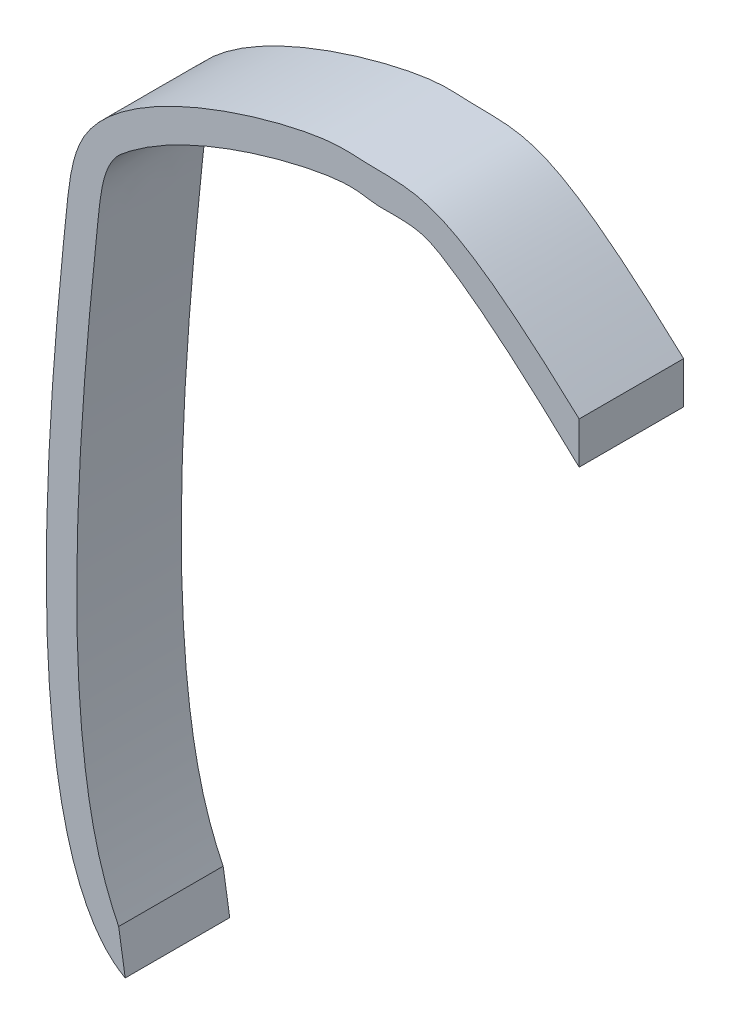
ISO-10303-21;
HEADER;
FILE_DESCRIPTION(('STEP AP214'),'2;1');
FILE_NAME('part.step','',(''),(''),'','','');
FILE_SCHEMA(('AUTOMOTIVE_DESIGN { 1 0 10303 214 1 1 1 1 }'));
ENDSEC;
DATA;
#1=APPLICATION_CONTEXT('core data for automotive mechanical design processes');
#2=APPLICATION_PROTOCOL_DEFINITION('international standard','automotive_design',2000,#1);
#3=PRODUCT_CONTEXT('',#1,'mechanical');
#4=PRODUCT('Part','Part','',(#3));
#5=PRODUCT_RELATED_PRODUCT_CATEGORY('part','',(#4));
#6=PRODUCT_DEFINITION_FORMATION('','',#4);
#7=PRODUCT_DEFINITION_CONTEXT('part definition',#1,'design');
#8=PRODUCT_DEFINITION('design','',#6,#7);
#9=PRODUCT_DEFINITION_SHAPE('','',#8);
#10=(LENGTH_UNIT() NAMED_UNIT(*) SI_UNIT(.MILLI.,.METRE.));
#11=(NAMED_UNIT(*) PLANE_ANGLE_UNIT() SI_UNIT($,.RADIAN.));
#12=(NAMED_UNIT(*) SI_UNIT($,.STERADIAN.) SOLID_ANGLE_UNIT());
#13=UNCERTAINTY_MEASURE_WITH_UNIT(LENGTH_MEASURE(1.E-05),#10,'distance_accuracy_value','');
#14=(GEOMETRIC_REPRESENTATION_CONTEXT(3) GLOBAL_UNCERTAINTY_ASSIGNED_CONTEXT((#13)) GLOBAL_UNIT_ASSIGNED_CONTEXT((#10,
#11,#12)) REPRESENTATION_CONTEXT('',''));
#15=CARTESIAN_POINT('',(0.,0.,0.));
#16=DIRECTION('',(0.,0.,1.));
#17=DIRECTION('',(1.,0.,0.));
#18=AXIS2_PLACEMENT_3D('',#15,#16,#17);
#19=CARTESIAN_POINT('',(0.,0.,0.));
#20=DIRECTION('',(-1.,0.,0.));
#21=DIRECTION('',(0.,0.,1.));
#22=AXIS2_PLACEMENT_3D('',#19,#20,#21);
#23=PLANE('',#22);
#24=DIRECTION('',(0.,-1.,0.));
#25=VECTOR('',#24,1.);
#26=CARTESIAN_POINT('',(0.,465.,0.));
#27=LINE('',#26,#25);
#28=CARTESIAN_POINT('',(0.,465.,0.));
#29=VERTEX_POINT('',#28);
#30=CARTESIAN_POINT('',(0.,445.,0.));
#31=VERTEX_POINT('',#30);
#32=EDGE_CURVE('E71',#29,#31,#27,.T.);
#33=ORIENTED_EDGE('',*,*,#32,.F.);
#34=DIRECTION('',(0.,0.,-1.));
#35=VECTOR('',#34,1.);
#36=CARTESIAN_POINT('',(0.,465.,0.));
#37=LINE('',#36,#35);
#38=CARTESIAN_POINT('',(0.,465.,50.));
#39=VERTEX_POINT('',#38);
#40=EDGE_CURVE('E73',#39,#29,#37,.T.);
#41=ORIENTED_EDGE('',*,*,#40,.F.);
#42=DIRECTION('',(0.,1.,0.));
#43=VECTOR('',#42,1.);
#44=CARTESIAN_POINT('',(0.,465.,50.));
#45=LINE('',#44,#43);
#46=CARTESIAN_POINT('',(0.,445.,50.));
#47=VERTEX_POINT('',#46);
#48=EDGE_CURVE('E88',#47,#39,#45,.T.);
#49=ORIENTED_EDGE('',*,*,#48,.F.);
#50=DIRECTION('',(0.,0.,1.));
#51=VECTOR('',#50,1.);
#52=CARTESIAN_POINT('',(0.,445.,0.));
#53=LINE('',#52,#51);
#54=EDGE_CURVE('E69',#31,#47,#53,.T.);
#55=ORIENTED_EDGE('',*,*,#54,.F.);
#56=EDGE_LOOP('',(#33,#41,#49,#55));
#57=FACE_BOUND('',#56,.T.);
#58=ADVANCED_FACE('F33',(#57),#23,.F.);
#59=CARTESIAN_POINT('',(-290.16002484198,584.039086371492,0.));
#60=DIRECTION('',(0.987598548904482,0.157000338221808,0.));
#61=DIRECTION('',(0.,0.,1.));
#62=AXIS2_PLACEMENT_3D('',#59,#60,#61);
#63=PLANE('',#62);
#64=DIRECTION('',(-0.157000338221808,0.987598548904482,0.));
#65=VECTOR('',#64,1.);
#66=CARTESIAN_POINT('',(-217.154867568839,124.805761130908,0.));
#67=LINE('',#66,#65);
#68=CARTESIAN_POINT('',(-217.154867568839,124.805761130908,0.));
#69=VERTEX_POINT('',#68);
#70=CARTESIAN_POINT('',(-220.294874333275,144.557732108998,0.));
#71=VERTEX_POINT('',#70);
#72=EDGE_CURVE('E93',#69,#71,#67,.T.);
#73=ORIENTED_EDGE('',*,*,#72,.T.);
#74=DIRECTION('',(0.,0.,1.));
#75=VECTOR('',#74,1.);
#76=CARTESIAN_POINT('',(-220.294874333275,144.557732108998,0.));
#77=LINE('',#76,#75);
#78=CARTESIAN_POINT('',(-220.294874333275,144.557732108998,50.));
#79=VERTEX_POINT('',#78);
#80=EDGE_CURVE('E167',#71,#79,#77,.T.);
#81=ORIENTED_EDGE('',*,*,#80,.T.);
#82=DIRECTION('',(0.157000338221808,-0.987598548904482,0.));
#83=VECTOR('',#82,1.);
#84=CARTESIAN_POINT('',(-217.154867568839,124.805761130908,50.));
#85=LINE('',#84,#83);
#86=CARTESIAN_POINT('',(-217.154867568839,124.805761130908,50.));
#87=VERTEX_POINT('',#86);
#88=EDGE_CURVE('E43',#79,#87,#85,.T.);
#89=ORIENTED_EDGE('',*,*,#88,.T.);
#90=DIRECTION('',(0.,0.,-1.));
#91=VECTOR('',#90,1.);
#92=CARTESIAN_POINT('',(-217.154867568839,124.805761130908,0.));
#93=LINE('',#92,#91);
#94=EDGE_CURVE('E11',#87,#69,#93,.T.);
#95=ORIENTED_EDGE('',*,*,#94,.T.);
#96=EDGE_LOOP('',(#73,#81,#89,#95));
#97=FACE_BOUND('',#96,.T.);
#98=ADVANCED_FACE('F113',(#97),#63,.T.);
#99=CARTESIAN_POINT('',(0.,465.,0.));
#100=DIRECTION('',(0.,0.,-1.));
#101=DIRECTION('',(-1.,0.,0.));
#102=AXIS2_PLACEMENT_3D('',#99,#100,#101);
#103=PLANE('',#102);
#104=CARTESIAN_POINT('',(0.,445.,0.));
#105=CARTESIAN_POINT('',(-16.5334790418302,460.69711347542,0.));
#106=CARTESIAN_POINT('',(-29.3494082354157,472.022889874603,0.));
#107=CARTESIAN_POINT('',(-44.3443437745634,484.331517105527,0.));
#108=CARTESIAN_POINT('',(-48.6324401807244,487.656274375071,0.));
#109=CARTESIAN_POINT('',(-56.0116089863636,493.123364084595,0.));
#110=CARTESIAN_POINT('',(-59.0953120526458,495.268253561463,0.));
#111=CARTESIAN_POINT('',(-64.4338384201303,498.794945149483,0.));
#112=CARTESIAN_POINT('',(-66.6891825700647,500.187034199315,0.));
#113=CARTESIAN_POINT('',(-71.068650718633,502.479301416099,0.));
#114=CARTESIAN_POINT('',(-73.212489970105,503.371980377179,0.));
#115=CARTESIAN_POINT('',(-78.0720677294839,504.630735217202,0.));
#116=CARTESIAN_POINT('',(-80.7872506423757,504.981714498095,0.));
#117=CARTESIAN_POINT('',(-87.0830582029829,505.275974958553,0.));
#118=CARTESIAN_POINT('',(-90.6563561100172,505.225226604885,0.));
#119=CARTESIAN_POINT('',(-97.4933270969146,505.178079929066,0.));
#120=CARTESIAN_POINT('',(-99.6523927721094,505.610978059376,0.));
#121=CARTESIAN_POINT('',(-104.85822401797,506.385191824863,0.));
#122=CARTESIAN_POINT('',(-107.974322721402,506.704258935392,0.));
#123=CARTESIAN_POINT('',(-115.485984851211,506.330616096859,0.));
#124=CARTESIAN_POINT('',(-119.284664335196,505.857088712353,0.));
#125=CARTESIAN_POINT('',(-127.739186614086,504.414231343719,0.));
#126=CARTESIAN_POINT('',(-132.402175874663,503.441341587578,0.));
#127=CARTESIAN_POINT('',(-147.136896460812,499.87292444242,0.));
#128=CARTESIAN_POINT('',(-157.954318983385,496.618871224689,0.));
#129=CARTESIAN_POINT('',(-178.884778297007,488.859974126448,0.));
#130=CARTESIAN_POINT('',(-188.987826213656,484.327309026921,0.));
#131=CARTESIAN_POINT('',(-201.741879108666,477.333437867636,0.));
#132=CARTESIAN_POINT('',(-205.592680852994,474.97778104944,0.));
#133=CARTESIAN_POINT('',(-212.314720560171,470.474235317099,0.));
#134=CARTESIAN_POINT('',(-215.177815709986,468.338522888187,0.));
#135=CARTESIAN_POINT('',(-219.378061590568,465.033849437963,0.));
#136=CARTESIAN_POINT('',(-220.943914518211,463.504561662782,0.));
#137=CARTESIAN_POINT('',(-223.705830572011,459.826160751409,0.));
#138=CARTESIAN_POINT('',(-224.893078939403,457.676595627404,0.));
#139=CARTESIAN_POINT('',(-226.862213936424,452.662277075239,0.));
#140=CARTESIAN_POINT('',(-227.642645645806,449.803221339329,0.));
#141=CARTESIAN_POINT('',(-228.889626205964,443.421353561903,0.));
#142=CARTESIAN_POINT('',(-229.357993867641,439.900825824972,0.));
#143=CARTESIAN_POINT('',(-232.168019123921,413.523508935029,0.));
#144=CARTESIAN_POINT('',(-234.974765903991,385.624540105678,0.));
#145=CARTESIAN_POINT('',(-239.183376487318,326.346527039198,0.));
#146=CARTESIAN_POINT('',(-240.575796680382,294.966331297681,0.));
#147=CARTESIAN_POINT('',(-240.154364956276,250.933872073782,0.));
#148=CARTESIAN_POINT('',(-239.596861021536,236.76516449067,0.));
#149=CARTESIAN_POINT('',(-237.509026520442,210.443523621524,0.));
#150=CARTESIAN_POINT('',(-235.968908449297,198.291871831841,0.));
#151=CARTESIAN_POINT('',(-233.004282773568,182.362591836326,0.));
#152=CARTESIAN_POINT('',(-231.909740224757,177.436743611926,0.));
#153=CARTESIAN_POINT('',(-229.58423629937,168.470000803379,0.));
#154=CARTESIAN_POINT('',(-228.353126708193,164.43176143749,0.));
#155=CARTESIAN_POINT('',(-225.895164868564,157.299545651994,0.));
#156=CARTESIAN_POINT('',(-224.673686044689,154.210508124478,0.));
#157=CARTESIAN_POINT('',(-222.38913326827,148.859569333134,0.));
#158=CARTESIAN_POINT('',(-221.340813457417,146.587455316381,0.));
#159=CARTESIAN_POINT('',(-220.294874333275,144.557732108998,0.));
#160=B_SPLINE_CURVE_WITH_KNOTS('',3,(#104,#105,#106,#107,#108,#109,#110,#111,#112,#113,#114,
#115,#116,#117,#118,#119,#120,#121,#122,#123,#124,#125,#126,#127,#128,#129,#130,#131,#132,#133,
#134,#135,#136,#137,#138,#139,#140,#141,#142,#143,#144,#145,#146,#147,#148,#149,#150,#151,#152,
#153,#154,#155,#156,#157,#158,#159),.UNSPECIFIED.,.F.,.F.,(4,2,2,2,2,2,2,2,2,2,2,2,2,2,2,2,2,2,
2,2,2,2,2,2,2,2,2,4),(0.,0.0869113832541203,0.13036707488118,0.173822766508241,
0.217278458135301,0.260734149762361,0.304189841389421,0.347645533016481,0.377540678676314,
0.407435824336146,0.428598834209535,0.449761844082924,0.492087863829703,0.534413883576481,
0.55557689344987,0.576739903323259,0.59208308296169,0.607426262600121,0.622769442238553,
0.638112621876984,0.728584466407738,0.819056310938492,0.864292233203869,0.909528155469246,
0.932146116601934,0.954764077734623,0.977382038867311,1.),.UNSPECIFIED.);
#161=EDGE_CURVE('E94',#31,#71,#160,.T.);
#162=ORIENTED_EDGE('',*,*,#161,.T.);
#163=ORIENTED_EDGE('',*,*,#72,.F.);
#164=CARTESIAN_POINT('',(0.,465.,0.));
#165=CARTESIAN_POINT('',(-16.9692495650053,480.696658697854,0.));
#166=CARTESIAN_POINT('',(-30.3952213348168,492.022655652211,0.));
#167=CARTESIAN_POINT('',(-52.4598074794755,508.217408808877,0.));
#168=CARTESIAN_POINT('',(-61.0987165659525,513.067089628339,0.));
#169=CARTESIAN_POINT('',(-75.7808060771797,518.702442276289,0.));
#170=CARTESIAN_POINT('',(-81.7862929650254,519.514777139451,0.));
#171=CARTESIAN_POINT('',(-93.9497907885615,520.144262840915,0.));
#172=CARTESIAN_POINT('',(-100.180764776125,519.959582986057,0.));
#173=CARTESIAN_POINT('',(-110.306837925926,520.536457233113,0.));
#174=CARTESIAN_POINT('',(-112.919950918061,520.599097646775,0.));
#175=CARTESIAN_POINT('',(-119.307732278662,520.237395221261,0.));
#176=CARTESIAN_POINT('',(-123.090066924832,519.826351572934,0.));
#177=CARTESIAN_POINT('',(-134.953779564474,517.746832800321,0.));
#178=CARTESIAN_POINT('',(-144.205346352819,515.638996136659,0.));
#179=CARTESIAN_POINT('',(-164.629307112682,509.598062562773,0.));
#180=CARTESIAN_POINT('',(-175.81293643024,505.675967471472,0.));
#181=CARTESIAN_POINT('',(-197.543612874847,496.126961242112,0.));
#182=CARTESIAN_POINT('',(-208.095949387086,490.496755164458,0.));
#183=CARTESIAN_POINT('',(-225.891605249607,477.692333758214,0.));
#184=CARTESIAN_POINT('',(-233.118942216872,470.488634598589,0.));
#185=CARTESIAN_POINT('',(-240.305558435385,457.255821877806,0.));
#186=CARTESIAN_POINT('',(-241.966957352378,451.442566506672,0.));
#187=CARTESIAN_POINT('',(-244.301676199682,438.676778126149,0.));
#188=CARTESIAN_POINT('',(-244.943498164111,431.716074982712,0.));
#189=CARTESIAN_POINT('',(-248.057759119408,401.377211394057,0.));
#190=CARTESIAN_POINT('',(-250.706753141214,373.268942599883,0.));
#191=CARTESIAN_POINT('',(-254.414932820795,313.379032918074,0.));
#192=CARTESIAN_POINT('',(-255.473936081157,281.595394740299,0.));
#193=CARTESIAN_POINT('',(-253.711884620831,221.658393242476,0.));
#194=CARTESIAN_POINT('',(-250.888894476327,193.480811618531,0.));
#195=CARTESIAN_POINT('',(-241.979829102966,159.670850248482,0.));
#196=CARTESIAN_POINT('',(-238.223799599952,149.814742735164,0.));
#197=CARTESIAN_POINT('',(-231.267292125818,138.000154937626,0.));
#198=CARTESIAN_POINT('',(-228.729391025024,134.559509425504,0.));
#199=CARTESIAN_POINT('',(-223.237815421055,128.812369246162,0.));
#200=CARTESIAN_POINT('',(-220.285023234843,126.508640145891,0.));
#201=CARTESIAN_POINT('',(-217.154867568839,124.805761130908,0.));
#202=B_SPLINE_CURVE_WITH_KNOTS('',3,(#164,#165,#166,#167,#168,#169,#170,#171,#172,#173,#174,
#175,#176,#177,#178,#179,#180,#181,#182,#183,#184,#185,#186,#187,#188,#189,#190,#191,#192,#193,
#194,#195,#196,#197,#198,#199,#200,#201),.UNSPECIFIED.,.F.,.F.,(4,2,2,2,2,2,2,2,2,2,2,2,2,2,2,2,
2,2,4),(0.,0.0869113832541203,0.173822766508241,0.260734149762361,0.347645533016481,
0.377540678676314,0.407435824336146,0.449761844082924,0.492087863829703,0.534413883576481,
0.576739903323259,0.607426262600121,0.638112621876984,0.728584466407738,0.819056310938492,
0.909528155469246,0.954764077734623,0.977382038867311,1.),.UNSPECIFIED.);
#203=EDGE_CURVE('E36',#29,#69,#202,.T.);
#204=ORIENTED_EDGE('',*,*,#203,.F.);
#205=ORIENTED_EDGE('',*,*,#32,.T.);
#206=EDGE_LOOP('',(#162,#163,#204,#205));
#207=FACE_BOUND('',#206,.T.);
#208=ADVANCED_FACE('F92',(#207),#103,.T.);
#209=CARTESIAN_POINT('',(0.,445.,0.));
#210=CARTESIAN_POINT('',(-16.5334790418302,460.69711347542,0.));
#211=CARTESIAN_POINT('',(-29.3494082354157,472.022889874603,0.));
#212=CARTESIAN_POINT('',(-44.3443437745634,484.331517105527,0.));
#213=CARTESIAN_POINT('',(-48.6324401807244,487.656274375071,0.));
#214=CARTESIAN_POINT('',(-56.0116089863636,493.123364084595,0.));
#215=CARTESIAN_POINT('',(-59.0953120526458,495.268253561463,0.));
#216=CARTESIAN_POINT('',(-64.4338384201303,498.794945149483,0.));
#217=CARTESIAN_POINT('',(-66.6891825700647,500.187034199315,0.));
#218=CARTESIAN_POINT('',(-71.068650718633,502.479301416099,0.));
#219=CARTESIAN_POINT('',(-73.212489970105,503.371980377179,0.));
#220=CARTESIAN_POINT('',(-78.0720677294839,504.630735217202,0.));
#221=CARTESIAN_POINT('',(-80.7872506423757,504.981714498095,0.));
#222=CARTESIAN_POINT('',(-87.0830582029829,505.275974958553,0.));
#223=CARTESIAN_POINT('',(-90.6563561100172,505.225226604885,0.));
#224=CARTESIAN_POINT('',(-97.4933270969146,505.178079929066,0.));
#225=CARTESIAN_POINT('',(-99.6523927721094,505.610978059376,0.));
#226=CARTESIAN_POINT('',(-104.85822401797,506.385191824863,0.));
#227=CARTESIAN_POINT('',(-107.974322721402,506.704258935392,0.));
#228=CARTESIAN_POINT('',(-115.485984851211,506.330616096859,0.));
#229=CARTESIAN_POINT('',(-119.284664335196,505.857088712353,0.));
#230=CARTESIAN_POINT('',(-127.739186614086,504.414231343719,0.));
#231=CARTESIAN_POINT('',(-132.402175874663,503.441341587578,0.));
#232=CARTESIAN_POINT('',(-147.136896460812,499.87292444242,0.));
#233=CARTESIAN_POINT('',(-157.954318983385,496.618871224689,0.));
#234=CARTESIAN_POINT('',(-178.884778297007,488.859974126448,0.));
#235=CARTESIAN_POINT('',(-188.987826213656,484.327309026921,0.));
#236=CARTESIAN_POINT('',(-201.741879108666,477.333437867636,0.));
#237=CARTESIAN_POINT('',(-205.592680852994,474.97778104944,0.));
#238=CARTESIAN_POINT('',(-212.314720560171,470.474235317099,0.));
#239=CARTESIAN_POINT('',(-215.177815709986,468.338522888187,0.));
#240=CARTESIAN_POINT('',(-219.378061590568,465.033849437963,0.));
#241=CARTESIAN_POINT('',(-220.943914518211,463.504561662782,0.));
#242=CARTESIAN_POINT('',(-223.705830572011,459.826160751409,0.));
#243=CARTESIAN_POINT('',(-224.893078939403,457.676595627404,0.));
#244=CARTESIAN_POINT('',(-226.862213936424,452.662277075239,0.));
#245=CARTESIAN_POINT('',(-227.642645645806,449.803221339329,0.));
#246=CARTESIAN_POINT('',(-228.889626205964,443.421353561903,0.));
#247=CARTESIAN_POINT('',(-229.357993867641,439.900825824972,0.));
#248=CARTESIAN_POINT('',(-232.168019123921,413.523508935029,0.));
#249=CARTESIAN_POINT('',(-234.974765903991,385.624540105678,0.));
#250=CARTESIAN_POINT('',(-239.183376487318,326.346527039198,0.));
#251=CARTESIAN_POINT('',(-240.575796680382,294.966331297681,0.));
#252=CARTESIAN_POINT('',(-240.154364956276,250.933872073782,0.));
#253=CARTESIAN_POINT('',(-239.596861021536,236.76516449067,0.));
#254=CARTESIAN_POINT('',(-237.509026520442,210.443523621524,0.));
#255=CARTESIAN_POINT('',(-235.968908449297,198.291871831841,0.));
#256=CARTESIAN_POINT('',(-233.004282773568,182.362591836326,0.));
#257=CARTESIAN_POINT('',(-231.909740224757,177.436743611926,0.));
#258=CARTESIAN_POINT('',(-229.58423629937,168.470000803379,0.));
#259=CARTESIAN_POINT('',(-228.353126708193,164.43176143749,0.));
#260=CARTESIAN_POINT('',(-225.895164868564,157.299545651994,0.));
#261=CARTESIAN_POINT('',(-224.673686044689,154.210508124478,0.));
#262=CARTESIAN_POINT('',(-222.38913326827,148.859569333134,0.));
#263=CARTESIAN_POINT('',(-221.340813457417,146.587455316381,0.));
#264=CARTESIAN_POINT('',(-220.294874333275,144.557732108998,0.));
#265=CARTESIAN_POINT('',(0.,445.,50.));
#266=CARTESIAN_POINT('',(-16.5334790418302,460.69711347542,50.));
#267=CARTESIAN_POINT('',(-29.3494082354157,472.022889874603,50.));
#268=CARTESIAN_POINT('',(-44.3443437745634,484.331517105527,50.));
#269=CARTESIAN_POINT('',(-48.6324401807244,487.656274375071,50.));
#270=CARTESIAN_POINT('',(-56.0116089863636,493.123364084595,50.));
#271=CARTESIAN_POINT('',(-59.0953120526458,495.268253561463,50.));
#272=CARTESIAN_POINT('',(-64.4338384201303,498.794945149483,50.));
#273=CARTESIAN_POINT('',(-66.6891825700647,500.187034199315,50.));
#274=CARTESIAN_POINT('',(-71.068650718633,502.479301416099,50.));
#275=CARTESIAN_POINT('',(-73.212489970105,503.371980377179,50.));
#276=CARTESIAN_POINT('',(-78.0720677294839,504.630735217202,50.));
#277=CARTESIAN_POINT('',(-80.7872506423757,504.981714498095,50.));
#278=CARTESIAN_POINT('',(-87.0830582029829,505.275974958553,50.));
#279=CARTESIAN_POINT('',(-90.6563561100172,505.225226604885,50.));
#280=CARTESIAN_POINT('',(-97.4933270969146,505.178079929066,50.));
#281=CARTESIAN_POINT('',(-99.6523927721094,505.610978059376,50.));
#282=CARTESIAN_POINT('',(-104.85822401797,506.385191824863,50.));
#283=CARTESIAN_POINT('',(-107.974322721402,506.704258935392,50.));
#284=CARTESIAN_POINT('',(-115.485984851211,506.330616096859,50.));
#285=CARTESIAN_POINT('',(-119.284664335196,505.857088712353,50.));
#286=CARTESIAN_POINT('',(-127.739186614086,504.414231343719,50.));
#287=CARTESIAN_POINT('',(-132.402175874663,503.441341587578,50.));
#288=CARTESIAN_POINT('',(-147.136896460812,499.87292444242,50.));
#289=CARTESIAN_POINT('',(-157.954318983385,496.618871224689,50.));
#290=CARTESIAN_POINT('',(-178.884778297007,488.859974126448,50.));
#291=CARTESIAN_POINT('',(-188.987826213656,484.327309026921,50.));
#292=CARTESIAN_POINT('',(-201.741879108666,477.333437867636,50.));
#293=CARTESIAN_POINT('',(-205.592680852994,474.97778104944,50.));
#294=CARTESIAN_POINT('',(-212.314720560171,470.474235317099,50.));
#295=CARTESIAN_POINT('',(-215.177815709986,468.338522888187,50.));
#296=CARTESIAN_POINT('',(-219.378061590568,465.033849437963,50.));
#297=CARTESIAN_POINT('',(-220.943914518211,463.504561662782,50.));
#298=CARTESIAN_POINT('',(-223.705830572011,459.826160751409,50.));
#299=CARTESIAN_POINT('',(-224.893078939403,457.676595627404,50.));
#300=CARTESIAN_POINT('',(-226.862213936424,452.662277075239,50.));
#301=CARTESIAN_POINT('',(-227.642645645806,449.803221339329,50.));
#302=CARTESIAN_POINT('',(-228.889626205964,443.421353561903,50.));
#303=CARTESIAN_POINT('',(-229.357993867641,439.900825824972,50.));
#304=CARTESIAN_POINT('',(-232.168019123921,413.523508935029,50.));
#305=CARTESIAN_POINT('',(-234.974765903991,385.624540105678,50.));
#306=CARTESIAN_POINT('',(-239.183376487318,326.346527039198,50.));
#307=CARTESIAN_POINT('',(-240.575796680382,294.966331297681,50.));
#308=CARTESIAN_POINT('',(-240.154364956276,250.933872073782,50.));
#309=CARTESIAN_POINT('',(-239.596861021536,236.76516449067,50.));
#310=CARTESIAN_POINT('',(-237.509026520442,210.443523621524,50.));
#311=CARTESIAN_POINT('',(-235.968908449297,198.291871831841,50.));
#312=CARTESIAN_POINT('',(-233.004282773568,182.362591836326,50.));
#313=CARTESIAN_POINT('',(-231.909740224757,177.436743611926,50.));
#314=CARTESIAN_POINT('',(-229.58423629937,168.470000803379,50.));
#315=CARTESIAN_POINT('',(-228.353126708193,164.43176143749,50.));
#316=CARTESIAN_POINT('',(-225.895164868564,157.299545651994,50.));
#317=CARTESIAN_POINT('',(-224.673686044689,154.210508124478,50.));
#318=CARTESIAN_POINT('',(-222.38913326827,148.859569333134,50.));
#319=CARTESIAN_POINT('',(-221.340813457417,146.587455316381,50.));
#320=CARTESIAN_POINT('',(-220.294874333275,144.557732108998,50.));
#321=B_SPLINE_SURFACE_WITH_KNOTS('',1,3,((#209,#210,#211,#212,#213,#214,#215,#216,#217,#218,
#219,#220,#221,#222,#223,#224,#225,#226,#227,#228,#229,#230,#231,#232,#233,#234,#235,#236,#237,
#238,#239,#240,#241,#242,#243,#244,#245,#246,#247,#248,#249,#250,#251,#252,#253,#254,#255,#256,
#257,#258,#259,#260,#261,#262,#263,#264),(#265,#266,#267,#268,#269,#270,#271,#272,#273,#274,
#275,#276,#277,#278,#279,#280,#281,#282,#283,#284,#285,#286,#287,#288,#289,#290,#291,#292,#293,
#294,#295,#296,#297,#298,#299,#300,#301,#302,#303,#304,#305,#306,#307,#308,#309,#310,#311,#312,
#313,#314,#315,#316,#317,#318,#319,#320)),.UNSPECIFIED.,.F.,.F.,.F.,(2,2),(4,2,2,2,2,2,2,2,2,2,
2,2,2,2,2,2,2,2,2,2,2,2,2,2,2,2,2,4),(0.,1.),(0.,0.0869113832541203,0.13036707488118,
0.173822766508241,0.217278458135301,0.260734149762361,0.304189841389421,0.347645533016481,
0.377540678676314,0.407435824336146,0.428598834209535,0.449761844082924,0.492087863829703,
0.534413883576481,0.55557689344987,0.576739903323259,0.59208308296169,0.607426262600121,
0.622769442238553,0.638112621876984,0.728584466407738,0.819056310938492,0.864292233203869,
0.909528155469246,0.932146116601934,0.954764077734623,0.977382038867311,1.),.UNSPECIFIED.);
#322=CARTESIAN_POINT('',(0.,445.,50.));
#323=CARTESIAN_POINT('',(-16.5334790418302,460.69711347542,50.));
#324=CARTESIAN_POINT('',(-29.3494082354157,472.022889874603,50.));
#325=CARTESIAN_POINT('',(-44.3443437745634,484.331517105527,50.));
#326=CARTESIAN_POINT('',(-48.6324401807244,487.656274375071,50.));
#327=CARTESIAN_POINT('',(-56.0116089863636,493.123364084595,50.));
#328=CARTESIAN_POINT('',(-59.0953120526458,495.268253561463,50.));
#329=CARTESIAN_POINT('',(-64.4338384201303,498.794945149483,50.));
#330=CARTESIAN_POINT('',(-66.6891825700647,500.187034199315,50.));
#331=CARTESIAN_POINT('',(-71.068650718633,502.479301416099,50.));
#332=CARTESIAN_POINT('',(-73.212489970105,503.371980377179,50.));
#333=CARTESIAN_POINT('',(-78.0720677294839,504.630735217202,50.));
#334=CARTESIAN_POINT('',(-80.7872506423757,504.981714498095,50.));
#335=CARTESIAN_POINT('',(-87.0830582029829,505.275974958553,50.));
#336=CARTESIAN_POINT('',(-90.6563561100172,505.225226604885,50.));
#337=CARTESIAN_POINT('',(-97.4933270969146,505.178079929066,50.));
#338=CARTESIAN_POINT('',(-99.6523927721094,505.610978059376,50.));
#339=CARTESIAN_POINT('',(-104.85822401797,506.385191824863,50.));
#340=CARTESIAN_POINT('',(-107.974322721402,506.704258935392,50.));
#341=CARTESIAN_POINT('',(-115.485984851211,506.330616096859,50.));
#342=CARTESIAN_POINT('',(-119.284664335196,505.857088712353,50.));
#343=CARTESIAN_POINT('',(-127.739186614086,504.414231343719,50.));
#344=CARTESIAN_POINT('',(-132.402175874663,503.441341587578,50.));
#345=CARTESIAN_POINT('',(-147.136896460812,499.87292444242,50.));
#346=CARTESIAN_POINT('',(-157.954318983385,496.618871224689,50.));
#347=CARTESIAN_POINT('',(-178.884778297007,488.859974126448,50.));
#348=CARTESIAN_POINT('',(-188.987826213656,484.327309026921,50.));
#349=CARTESIAN_POINT('',(-201.741879108666,477.333437867636,50.));
#350=CARTESIAN_POINT('',(-205.592680852994,474.97778104944,50.));
#351=CARTESIAN_POINT('',(-212.314720560171,470.474235317099,50.));
#352=CARTESIAN_POINT('',(-215.177815709986,468.338522888187,50.));
#353=CARTESIAN_POINT('',(-219.378061590568,465.033849437963,50.));
#354=CARTESIAN_POINT('',(-220.943914518211,463.504561662782,50.));
#355=CARTESIAN_POINT('',(-223.705830572011,459.826160751409,50.));
#356=CARTESIAN_POINT('',(-224.893078939403,457.676595627404,50.));
#357=CARTESIAN_POINT('',(-226.862213936424,452.662277075239,50.));
#358=CARTESIAN_POINT('',(-227.642645645806,449.803221339329,50.));
#359=CARTESIAN_POINT('',(-228.889626205964,443.421353561903,50.));
#360=CARTESIAN_POINT('',(-229.357993867641,439.900825824972,50.));
#361=CARTESIAN_POINT('',(-232.168019123921,413.523508935029,50.));
#362=CARTESIAN_POINT('',(-234.974765903991,385.624540105678,50.));
#363=CARTESIAN_POINT('',(-239.183376487318,326.346527039198,50.));
#364=CARTESIAN_POINT('',(-240.575796680382,294.966331297681,50.));
#365=CARTESIAN_POINT('',(-240.154364956276,250.933872073782,50.));
#366=CARTESIAN_POINT('',(-239.596861021536,236.76516449067,50.));
#367=CARTESIAN_POINT('',(-237.509026520442,210.443523621524,50.));
#368=CARTESIAN_POINT('',(-235.968908449297,198.291871831841,50.));
#369=CARTESIAN_POINT('',(-233.004282773568,182.362591836326,50.));
#370=CARTESIAN_POINT('',(-231.909740224757,177.436743611926,50.));
#371=CARTESIAN_POINT('',(-229.58423629937,168.470000803379,50.));
#372=CARTESIAN_POINT('',(-228.353126708193,164.43176143749,50.));
#373=CARTESIAN_POINT('',(-225.895164868564,157.299545651994,50.));
#374=CARTESIAN_POINT('',(-224.673686044689,154.210508124478,50.));
#375=CARTESIAN_POINT('',(-222.38913326827,148.859569333134,50.));
#376=CARTESIAN_POINT('',(-221.340813457417,146.587455316381,50.));
#377=CARTESIAN_POINT('',(-220.294874333275,144.557732108998,50.));
#378=B_SPLINE_CURVE_WITH_KNOTS('',3,(#322,#323,#324,#325,#326,#327,#328,#329,#330,#331,#332,
#333,#334,#335,#336,#337,#338,#339,#340,#341,#342,#343,#344,#345,#346,#347,#348,#349,#350,#351,
#352,#353,#354,#355,#356,#357,#358,#359,#360,#361,#362,#363,#364,#365,#366,#367,#368,#369,#370,
#371,#372,#373,#374,#375,#376,#377),.UNSPECIFIED.,.F.,.F.,(4,2,2,2,2,2,2,2,2,2,2,2,2,2,2,2,2,2,
2,2,2,2,2,2,2,2,2,4),(0.,0.0869113832541203,0.13036707488118,0.173822766508241,
0.217278458135301,0.260734149762361,0.304189841389421,0.347645533016481,0.377540678676314,
0.407435824336146,0.428598834209535,0.449761844082924,0.492087863829703,0.534413883576481,
0.55557689344987,0.576739903323259,0.59208308296169,0.607426262600121,0.622769442238553,
0.638112621876984,0.728584466407738,0.819056310938492,0.864292233203869,0.909528155469246,
0.932146116601934,0.954764077734623,0.977382038867311,1.),.UNSPECIFIED.);
#379=EDGE_CURVE('E151',#47,#79,#378,.T.);
#380=ORIENTED_EDGE('',*,*,#379,.T.);
#381=ORIENTED_EDGE('',*,*,#80,.F.);
#382=ORIENTED_EDGE('',*,*,#161,.F.);
#383=ORIENTED_EDGE('',*,*,#54,.T.);
#384=EDGE_LOOP('',(#380,#381,#382,#383));
#385=FACE_BOUND('',#384,.T.);
#386=ADVANCED_FACE('F112',(#385),#321,.T.);
#387=CARTESIAN_POINT('',(0.,465.,50.));
#388=DIRECTION('',(0.,0.,-1.));
#389=DIRECTION('',(-1.,0.,0.));
#390=AXIS2_PLACEMENT_3D('',#387,#388,#389);
#391=PLANE('',#390);
#392=CARTESIAN_POINT('',(0.,465.,50.));
#393=CARTESIAN_POINT('',(-16.9692495650053,480.696658697854,50.));
#394=CARTESIAN_POINT('',(-30.3952213348168,492.022655652211,50.));
#395=CARTESIAN_POINT('',(-52.4598074794755,508.217408808877,50.));
#396=CARTESIAN_POINT('',(-61.0987165659525,513.067089628339,50.));
#397=CARTESIAN_POINT('',(-75.7808060771797,518.702442276289,50.));
#398=CARTESIAN_POINT('',(-81.7862929650254,519.514777139451,50.));
#399=CARTESIAN_POINT('',(-93.9497907885615,520.144262840915,50.));
#400=CARTESIAN_POINT('',(-100.180764776125,519.959582986057,50.));
#401=CARTESIAN_POINT('',(-110.306837925926,520.536457233113,50.));
#402=CARTESIAN_POINT('',(-112.919950918061,520.599097646775,50.));
#403=CARTESIAN_POINT('',(-119.307732278662,520.237395221261,50.));
#404=CARTESIAN_POINT('',(-123.090066924832,519.826351572934,50.));
#405=CARTESIAN_POINT('',(-134.953779564474,517.746832800321,50.));
#406=CARTESIAN_POINT('',(-144.205346352819,515.638996136659,50.));
#407=CARTESIAN_POINT('',(-164.629307112682,509.598062562773,50.));
#408=CARTESIAN_POINT('',(-175.81293643024,505.675967471472,50.));
#409=CARTESIAN_POINT('',(-197.543612874847,496.126961242112,50.));
#410=CARTESIAN_POINT('',(-208.095949387086,490.496755164458,50.));
#411=CARTESIAN_POINT('',(-225.891605249607,477.692333758214,50.));
#412=CARTESIAN_POINT('',(-233.118942216872,470.488634598589,50.));
#413=CARTESIAN_POINT('',(-240.305558435385,457.255821877806,50.));
#414=CARTESIAN_POINT('',(-241.966957352378,451.442566506672,50.));
#415=CARTESIAN_POINT('',(-244.301676199682,438.676778126149,50.));
#416=CARTESIAN_POINT('',(-244.943498164111,431.716074982712,50.));
#417=CARTESIAN_POINT('',(-248.057759119408,401.377211394057,50.));
#418=CARTESIAN_POINT('',(-250.706753141214,373.268942599883,50.));
#419=CARTESIAN_POINT('',(-254.414932820795,313.379032918074,50.));
#420=CARTESIAN_POINT('',(-255.473936081157,281.595394740299,50.));
#421=CARTESIAN_POINT('',(-253.711884620831,221.658393242476,50.));
#422=CARTESIAN_POINT('',(-250.888894476327,193.480811618531,50.));
#423=CARTESIAN_POINT('',(-241.979829102966,159.670850248482,50.));
#424=CARTESIAN_POINT('',(-238.223799599952,149.814742735164,50.));
#425=CARTESIAN_POINT('',(-231.267292125818,138.000154937626,50.));
#426=CARTESIAN_POINT('',(-228.729391025024,134.559509425504,50.));
#427=CARTESIAN_POINT('',(-223.237815421055,128.812369246162,50.));
#428=CARTESIAN_POINT('',(-220.285023234843,126.508640145891,50.));
#429=CARTESIAN_POINT('',(-217.154867568839,124.805761130908,50.));
#430=B_SPLINE_CURVE_WITH_KNOTS('',3,(#392,#393,#394,#395,#396,#397,#398,#399,#400,#401,#402,
#403,#404,#405,#406,#407,#408,#409,#410,#411,#412,#413,#414,#415,#416,#417,#418,#419,#420,#421,
#422,#423,#424,#425,#426,#427,#428,#429),.UNSPECIFIED.,.F.,.F.,(4,2,2,2,2,2,2,2,2,2,2,2,2,2,2,2,
2,2,4),(0.,0.0869113832541203,0.173822766508241,0.260734149762361,0.347645533016481,
0.377540678676314,0.407435824336146,0.449761844082924,0.492087863829703,0.534413883576481,
0.576739903323259,0.607426262600121,0.638112621876984,0.728584466407738,0.819056310938492,
0.909528155469246,0.954764077734623,0.977382038867311,1.),.UNSPECIFIED.);
#431=EDGE_CURVE('E86',#39,#87,#430,.T.);
#432=ORIENTED_EDGE('',*,*,#431,.T.);
#433=ORIENTED_EDGE('',*,*,#88,.F.);
#434=ORIENTED_EDGE('',*,*,#379,.F.);
#435=ORIENTED_EDGE('',*,*,#48,.T.);
#436=EDGE_LOOP('',(#432,#433,#434,#435));
#437=FACE_BOUND('',#436,.T.);
#438=ADVANCED_FACE('F118',(#437),#391,.F.);
#439=CARTESIAN_POINT('',(0.,465.,50.));
#440=CARTESIAN_POINT('',(-16.9692495650053,480.696658697854,50.));
#441=CARTESIAN_POINT('',(-30.3952213348168,492.022655652211,50.));
#442=CARTESIAN_POINT('',(-46.9436609433108,504.168720519711,50.));
#443=CARTESIAN_POINT('',(-51.8610928363316,507.409466162276,50.));
#444=CARTESIAN_POINT('',(-60.7743090683439,512.563772303303,50.));
#445=CARTESIAN_POINT('',(-64.7692389437592,514.475927790327,50.));
#446=CARTESIAN_POINT('',(-72.1102836993729,517.293604114301,50.));
#447=CARTESIAN_POINT('',(-75.4543018215437,518.199689467403,50.));
#448=CARTESIAN_POINT('',(-81.811532873946,519.387096905591,50.));
#449=CARTESIAN_POINT('',(-84.8271674209095,519.672148564817,50.));
#450=CARTESIAN_POINT('',(-90.9089163326775,519.986891415549,50.));
#451=CARTESIAN_POINT('',(-93.9781170663094,520.015797172471,50.));
#452=CARTESIAN_POINT('',(-100.498427665117,520.110072877828,50.));
#453=CARTESIAN_POINT('',(-103.947981525756,520.174198295841,50.));
#454=CARTESIAN_POINT('',(-110.306837925926,520.536457233113,50.));
#455=CARTESIAN_POINT('',(-112.919950918061,520.599097646775,50.));
#456=CARTESIAN_POINT('',(-119.307732278662,520.237395221261,50.));
#457=CARTESIAN_POINT('',(-123.090066924832,519.826351572934,50.));
#458=CARTESIAN_POINT('',(-131.47734898745,518.356195389098,50.));
#459=CARTESIAN_POINT('',(-135.531338859264,517.528063346342,50.));
#460=CARTESIAN_POINT('',(-144.447807037154,515.413689765745,50.));
#461=CARTESIAN_POINT('',(-149.311336542784,514.128762743188,50.));
#462=CARTESIAN_POINT('',(-164.629307112682,509.598062562773,50.));
#463=CARTESIAN_POINT('',(-175.81293643024,505.675967471472,50.));
#464=CARTESIAN_POINT('',(-197.543612874847,496.126961242112,50.));
#465=CARTESIAN_POINT('',(-208.095949387086,490.496755164458,50.));
#466=CARTESIAN_POINT('',(-221.442691283976,480.893439109775,50.));
#467=CARTESIAN_POINT('',(-225.476285741849,477.499597787261,50.));
#468=CARTESIAN_POINT('',(-232.357385455332,470.379964898914,50.));
#469=CARTESIAN_POINT('',(-235.202019525439,466.653036443762,50.));
#470=CARTESIAN_POINT('',(-238.795327634696,460.03663008337,50.));
#471=CARTESIAN_POINT('',(-239.959154885504,457.192599040403,50.));
#472=CARTESIAN_POINT('',(-241.836958906455,451.300762008823,50.));
#473=CARTESIAN_POINT('',(-242.550637064204,448.251119411541,50.));
#474=CARTESIAN_POINT('',(-243.717996487856,441.86822522128,50.));
#475=CARTESIAN_POINT('',(-244.170438926267,438.534927024839,50.));
#476=CARTESIAN_POINT('',(-244.980575928732,431.537593866235,50.));
#477=CARTESIAN_POINT('',(-245.337880581285,427.874035240973,50.));
#478=CARTESIAN_POINT('',(-248.057759119408,401.377211394057,50.));
#479=CARTESIAN_POINT('',(-250.706753141214,373.268942599883,50.));
#480=CARTESIAN_POINT('',(-254.414932820795,313.379032918074,50.));
#481=CARTESIAN_POINT('',(-255.473936081157,281.595394740299,50.));
#482=CARTESIAN_POINT('',(-254.152397485913,236.642643616932,50.));
#483=CARTESIAN_POINT('',(-253.226426255486,222.112558908278,50.));
#484=CARTESIAN_POINT('',(-250.110180058135,194.897629361657,50.));
#485=CARTESIAN_POINT('',(-247.91920601854,182.210824495181,50.));
#486=CARTESIAN_POINT('',(-243.46467333186,165.305843810157,50.));
#487=CARTESIAN_POINT('',(-241.785091201302,160.025658552139,50.));
#488=CARTESIAN_POINT('',(-238.005513306252,150.310966318299,50.));
#489=CARTESIAN_POINT('',(-235.904963775241,145.876546802652,50.));
#490=CARTESIAN_POINT('',(-231.267292125818,138.000154937626,50.));
#491=CARTESIAN_POINT('',(-228.729391025024,134.559509425504,50.));
#492=CARTESIAN_POINT('',(-223.237815421055,128.812369246162,50.));
#493=CARTESIAN_POINT('',(-220.285023234843,126.508640145891,50.));
#494=CARTESIAN_POINT('',(-217.154867568839,124.805761130908,50.));
#495=CARTESIAN_POINT('',(0.,465.,0.));
#496=CARTESIAN_POINT('',(-16.9692495650053,480.696658697854,0.));
#497=CARTESIAN_POINT('',(-30.3952213348168,492.022655652211,0.));
#498=CARTESIAN_POINT('',(-46.9436609433108,504.168720519711,0.));
#499=CARTESIAN_POINT('',(-51.8610928363316,507.409466162276,0.));
#500=CARTESIAN_POINT('',(-60.7743090683439,512.563772303303,0.));
#501=CARTESIAN_POINT('',(-64.7692389437592,514.475927790327,0.));
#502=CARTESIAN_POINT('',(-72.1102836993729,517.293604114301,0.));
#503=CARTESIAN_POINT('',(-75.4543018215437,518.199689467403,0.));
#504=CARTESIAN_POINT('',(-81.811532873946,519.387096905591,0.));
#505=CARTESIAN_POINT('',(-84.8271674209095,519.672148564817,0.));
#506=CARTESIAN_POINT('',(-90.9089163326775,519.986891415549,0.));
#507=CARTESIAN_POINT('',(-93.9781170663094,520.015797172471,0.));
#508=CARTESIAN_POINT('',(-100.498427665117,520.110072877828,0.));
#509=CARTESIAN_POINT('',(-103.947981525756,520.174198295841,0.));
#510=CARTESIAN_POINT('',(-110.306837925926,520.536457233113,0.));
#511=CARTESIAN_POINT('',(-112.919950918061,520.599097646775,0.));
#512=CARTESIAN_POINT('',(-119.307732278662,520.237395221261,0.));
#513=CARTESIAN_POINT('',(-123.090066924832,519.826351572934,0.));
#514=CARTESIAN_POINT('',(-131.47734898745,518.356195389098,0.));
#515=CARTESIAN_POINT('',(-135.531338859264,517.528063346342,0.));
#516=CARTESIAN_POINT('',(-144.447807037154,515.413689765745,0.));
#517=CARTESIAN_POINT('',(-149.311336542784,514.128762743188,0.));
#518=CARTESIAN_POINT('',(-164.629307112682,509.598062562773,0.));
#519=CARTESIAN_POINT('',(-175.81293643024,505.675967471472,0.));
#520=CARTESIAN_POINT('',(-197.543612874847,496.126961242112,0.));
#521=CARTESIAN_POINT('',(-208.095949387086,490.496755164458,0.));
#522=CARTESIAN_POINT('',(-221.442691283976,480.893439109775,0.));
#523=CARTESIAN_POINT('',(-225.476285741849,477.499597787261,0.));
#524=CARTESIAN_POINT('',(-232.357385455332,470.379964898914,0.));
#525=CARTESIAN_POINT('',(-235.202019525439,466.653036443762,0.));
#526=CARTESIAN_POINT('',(-238.795327634696,460.03663008337,0.));
#527=CARTESIAN_POINT('',(-239.959154885504,457.192599040403,0.));
#528=CARTESIAN_POINT('',(-241.836958906455,451.300762008823,0.));
#529=CARTESIAN_POINT('',(-242.550637064204,448.251119411541,0.));
#530=CARTESIAN_POINT('',(-243.717996487856,441.86822522128,0.));
#531=CARTESIAN_POINT('',(-244.170438926267,438.534927024839,0.));
#532=CARTESIAN_POINT('',(-244.980575928732,431.537593866235,0.));
#533=CARTESIAN_POINT('',(-245.337880581285,427.874035240973,0.));
#534=CARTESIAN_POINT('',(-248.057759119408,401.377211394057,0.));
#535=CARTESIAN_POINT('',(-250.706753141214,373.268942599883,0.));
#536=CARTESIAN_POINT('',(-254.414932820795,313.379032918074,0.));
#537=CARTESIAN_POINT('',(-255.473936081157,281.595394740299,0.));
#538=CARTESIAN_POINT('',(-254.152397485913,236.642643616932,0.));
#539=CARTESIAN_POINT('',(-253.226426255486,222.112558908278,0.));
#540=CARTESIAN_POINT('',(-250.110180058135,194.897629361657,0.));
#541=CARTESIAN_POINT('',(-247.91920601854,182.210824495181,0.));
#542=CARTESIAN_POINT('',(-243.46467333186,165.305843810157,0.));
#543=CARTESIAN_POINT('',(-241.785091201302,160.025658552139,0.));
#544=CARTESIAN_POINT('',(-238.005513306252,150.310966318299,0.));
#545=CARTESIAN_POINT('',(-235.904963775241,145.876546802652,0.));
#546=CARTESIAN_POINT('',(-231.267292125818,138.000154937626,0.));
#547=CARTESIAN_POINT('',(-228.729391025024,134.559509425504,0.));
#548=CARTESIAN_POINT('',(-223.237815421055,128.812369246162,0.));
#549=CARTESIAN_POINT('',(-220.285023234843,126.508640145891,0.));
#550=CARTESIAN_POINT('',(-217.154867568839,124.805761130908,0.));
#551=B_SPLINE_SURFACE_WITH_KNOTS('',1,3,((#439,#440,#441,#442,#443,#444,#445,#446,#447,#448,
#449,#450,#451,#452,#453,#454,#455,#456,#457,#458,#459,#460,#461,#462,#463,#464,#465,#466,#467,
#468,#469,#470,#471,#472,#473,#474,#475,#476,#477,#478,#479,#480,#481,#482,#483,#484,#485,#486,
#487,#488,#489,#490,#491,#492,#493,#494),(#495,#496,#497,#498,#499,#500,#501,#502,#503,#504,
#505,#506,#507,#508,#509,#510,#511,#512,#513,#514,#515,#516,#517,#518,#519,#520,#521,#522,#523,
#524,#525,#526,#527,#528,#529,#530,#531,#532,#533,#534,#535,#536,#537,#538,#539,#540,#541,#542,
#543,#544,#545,#546,#547,#548,#549,#550)),.UNSPECIFIED.,.F.,.F.,.F.,(2,2),(4,2,2,2,2,2,2,2,2,2,
2,2,2,2,2,2,2,2,2,2,2,2,2,2,2,2,2,4),(0.,1.),(0.,0.0869113832541203,0.13036707488118,
0.173822766508241,0.217278458135301,0.260734149762361,0.304189841389421,0.347645533016481,
0.377540678676314,0.407435824336146,0.428598834209535,0.449761844082924,0.492087863829703,
0.534413883576481,0.55557689344987,0.576739903323259,0.59208308296169,0.607426262600121,
0.622769442238553,0.638112621876984,0.728584466407738,0.819056310938492,0.864292233203869,
0.909528155469246,0.932146116601934,0.954764077734623,0.977382038867311,1.),.UNSPECIFIED.);
#552=ORIENTED_EDGE('',*,*,#94,.F.);
#553=ORIENTED_EDGE('',*,*,#431,.F.);
#554=ORIENTED_EDGE('',*,*,#40,.T.);
#555=ORIENTED_EDGE('',*,*,#203,.T.);
#556=EDGE_LOOP('',(#552,#553,#554,#555));
#557=FACE_BOUND('',#556,.T.);
#558=ADVANCED_FACE('F83',(#557),#551,.T.);
#559=CLOSED_SHELL('',(#58,#98,#208,#386,#438,#558));
#560=MANIFOLD_SOLID_BREP('B2',#559);
#561=ADVANCED_BREP_SHAPE_REPRESENTATION('',(#18,#560),#14);
#562=SHAPE_DEFINITION_REPRESENTATION(#9,#561);
ENDSEC;
END-ISO-10303-21;
